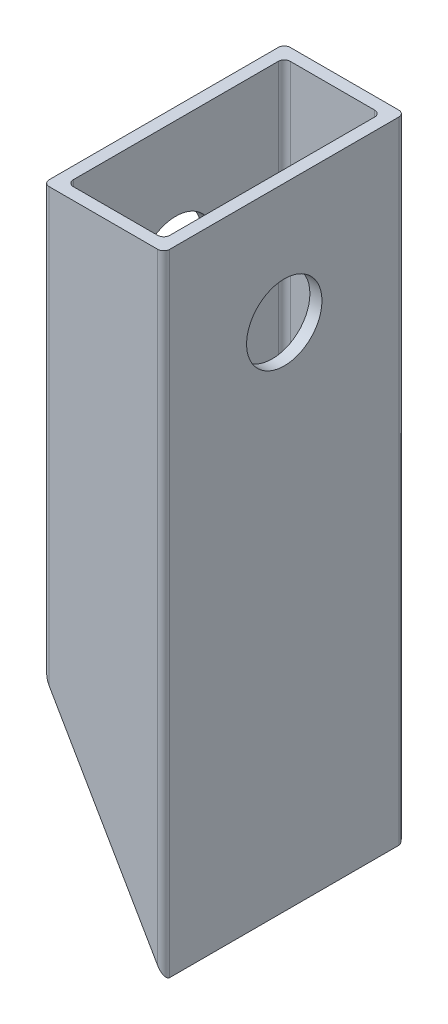
ISO-10303-21;
HEADER;
FILE_DESCRIPTION(('STEP AP214'),'2;1');
FILE_NAME('part.step','',(''),(''),'','','');
FILE_SCHEMA(('AUTOMOTIVE_DESIGN { 1 0 10303 214 1 1 1 1 }'));
ENDSEC;
DATA;
#1=APPLICATION_CONTEXT('core data for automotive mechanical design processes');
#2=APPLICATION_PROTOCOL_DEFINITION('international standard','automotive_design',2000,#1);
#3=PRODUCT_CONTEXT('',#1,'mechanical');
#4=PRODUCT('Part','Part','',(#3));
#5=PRODUCT_RELATED_PRODUCT_CATEGORY('part','',(#4));
#6=PRODUCT_DEFINITION_FORMATION('','',#4);
#7=PRODUCT_DEFINITION_CONTEXT('part definition',#1,'design');
#8=PRODUCT_DEFINITION('design','',#6,#7);
#9=PRODUCT_DEFINITION_SHAPE('','',#8);
#10=(LENGTH_UNIT() NAMED_UNIT(*) SI_UNIT(.MILLI.,.METRE.));
#11=(NAMED_UNIT(*) PLANE_ANGLE_UNIT() SI_UNIT($,.RADIAN.));
#12=(NAMED_UNIT(*) SI_UNIT($,.STERADIAN.) SOLID_ANGLE_UNIT());
#13=UNCERTAINTY_MEASURE_WITH_UNIT(LENGTH_MEASURE(1.E-05),#10,'distance_accuracy_value','');
#14=(GEOMETRIC_REPRESENTATION_CONTEXT(3) GLOBAL_UNCERTAINTY_ASSIGNED_CONTEXT((#13)) GLOBAL_UNIT_ASSIGNED_CONTEXT((#10,
#11,#12)) REPRESENTATION_CONTEXT('',''));
#15=CARTESIAN_POINT('',(0.,0.,0.));
#16=DIRECTION('',(0.,0.,1.));
#17=DIRECTION('',(1.,0.,0.));
#18=AXIS2_PLACEMENT_3D('',#15,#16,#17);
#19=CARTESIAN_POINT('',(2.,705.,-2.));
#20=DIRECTION('',(0.,-1.,0.));
#21=DIRECTION('',(0.,0.,-1.));
#22=AXIS2_PLACEMENT_3D('',#19,#20,#21);
#23=PLANE('',#22);
#24=CARTESIAN_POINT('',(2.,705.,-2.));
#25=DIRECTION('',(0.,1.,0.));
#26=DIRECTION('',(0.,0.,-1.));
#27=AXIS2_PLACEMENT_3D('',#24,#25,#26);
#28=CIRCLE('',#27,2.);
#29=CARTESIAN_POINT('',(0.,705.,-2.00000000000001));
#30=VERTEX_POINT('',#29);
#31=CARTESIAN_POINT('',(2.00000000000001,705.,0.));
#32=VERTEX_POINT('',#31);
#33=EDGE_CURVE('E241',#30,#32,#28,.T.);
#34=ORIENTED_EDGE('',*,*,#33,.T.);
#35=DIRECTION('',(1.,0.,0.));
#36=VECTOR('',#35,1.);
#37=CARTESIAN_POINT('',(2.00000000000001,705.,0.));
#38=LINE('',#37,#36);
#39=CARTESIAN_POINT('',(38.,705.,0.));
#40=VERTEX_POINT('',#39);
#41=EDGE_CURVE('E244',#32,#40,#38,.T.);
#42=ORIENTED_EDGE('',*,*,#41,.T.);
#43=CARTESIAN_POINT('',(38.,705.,-2.));
#44=DIRECTION('',(0.,1.,0.));
#45=DIRECTION('',(0.,0.,-1.));
#46=AXIS2_PLACEMENT_3D('',#43,#44,#45);
#47=CIRCLE('',#46,2.);
#48=CARTESIAN_POINT('',(40.,705.,-2.00000000000001));
#49=VERTEX_POINT('',#48);
#50=EDGE_CURVE('E246',#40,#49,#47,.T.);
#51=ORIENTED_EDGE('',*,*,#50,.T.);
#52=DIRECTION('',(0.,0.,-1.));
#53=VECTOR('',#52,1.);
#54=CARTESIAN_POINT('',(40.,705.,-2.00000000000001));
#55=LINE('',#54,#53);
#56=CARTESIAN_POINT('',(40.,705.,-78.));
#57=VERTEX_POINT('',#56);
#58=EDGE_CURVE('E248',#49,#57,#55,.T.);
#59=ORIENTED_EDGE('',*,*,#58,.T.);
#60=CARTESIAN_POINT('',(38.,705.,-78.));
#61=DIRECTION('',(0.,1.,0.));
#62=DIRECTION('',(0.,0.,-1.));
#63=AXIS2_PLACEMENT_3D('',#60,#61,#62);
#64=CIRCLE('',#63,2.);
#65=CARTESIAN_POINT('',(38.,705.,-80.));
#66=VERTEX_POINT('',#65);
#67=EDGE_CURVE('E170',#57,#66,#64,.T.);
#68=ORIENTED_EDGE('',*,*,#67,.T.);
#69=DIRECTION('',(-1.,0.,0.));
#70=VECTOR('',#69,1.);
#71=CARTESIAN_POINT('',(2.,705.,-80.));
#72=LINE('',#71,#70);
#73=CARTESIAN_POINT('',(2.,705.,-80.));
#74=VERTEX_POINT('',#73);
#75=EDGE_CURVE('E251',#66,#74,#72,.T.);
#76=ORIENTED_EDGE('',*,*,#75,.T.);
#77=CARTESIAN_POINT('',(2.,705.,-78.));
#78=DIRECTION('',(0.,1.,0.));
#79=DIRECTION('',(0.,0.,-1.));
#80=AXIS2_PLACEMENT_3D('',#77,#78,#79);
#81=CIRCLE('',#80,2.);
#82=CARTESIAN_POINT('',(0.,705.,-78.));
#83=VERTEX_POINT('',#82);
#84=EDGE_CURVE('E253',#74,#83,#81,.T.);
#85=ORIENTED_EDGE('',*,*,#84,.T.);
#86=DIRECTION('',(0.,0.,1.));
#87=VECTOR('',#86,1.);
#88=CARTESIAN_POINT('',(0.,705.,-2.00000000000001));
#89=LINE('',#88,#87);
#90=EDGE_CURVE('E255',#83,#30,#89,.T.);
#91=ORIENTED_EDGE('',*,*,#90,.T.);
#92=EDGE_LOOP('',(#34,#42,#51,#59,#68,#76,#85,#91));
#93=FACE_BOUND('',#92,.T.);
#94=CARTESIAN_POINT('',(34.,705.,-6.));
#95=DIRECTION('',(0.,1.,0.));
#96=DIRECTION('',(0.,0.,1.));
#97=AXIS2_PLACEMENT_3D('',#94,#95,#96);
#98=CIRCLE('',#97,2.);
#99=CARTESIAN_POINT('',(34.,705.,-4.));
#100=VERTEX_POINT('',#99);
#101=CARTESIAN_POINT('',(36.,705.,-6.00000000000001));
#102=VERTEX_POINT('',#101);
#103=EDGE_CURVE('E189',#100,#102,#98,.T.);
#104=ORIENTED_EDGE('',*,*,#103,.F.);
#105=DIRECTION('',(1.,0.,0.));
#106=VECTOR('',#105,1.);
#107=CARTESIAN_POINT('',(6.00000000000001,705.,-4.));
#108=LINE('',#107,#106);
#109=CARTESIAN_POINT('',(6.00000000000001,705.,-4.));
#110=VERTEX_POINT('',#109);
#111=EDGE_CURVE('E215',#110,#100,#108,.T.);
#112=ORIENTED_EDGE('',*,*,#111,.F.);
#113=CARTESIAN_POINT('',(6.,705.,-6.));
#114=DIRECTION('',(0.,1.,0.));
#115=DIRECTION('',(0.,0.,1.));
#116=AXIS2_PLACEMENT_3D('',#113,#114,#115);
#117=CIRCLE('',#116,2.);
#118=CARTESIAN_POINT('',(4.,705.,-6.00000000000002));
#119=VERTEX_POINT('',#118);
#120=EDGE_CURVE('E212',#119,#110,#117,.T.);
#121=ORIENTED_EDGE('',*,*,#120,.F.);
#122=DIRECTION('',(0.,0.,1.));
#123=VECTOR('',#122,1.);
#124=CARTESIAN_POINT('',(4.,705.,-6.00000000000001));
#125=LINE('',#124,#123);
#126=CARTESIAN_POINT('',(4.,705.,-74.));
#127=VERTEX_POINT('',#126);
#128=EDGE_CURVE('E210',#127,#119,#125,.T.);
#129=ORIENTED_EDGE('',*,*,#128,.F.);
#130=CARTESIAN_POINT('',(6.,705.,-74.));
#131=DIRECTION('',(0.,1.,0.));
#132=DIRECTION('',(0.,0.,1.));
#133=AXIS2_PLACEMENT_3D('',#130,#131,#132);
#134=CIRCLE('',#133,2.);
#135=CARTESIAN_POINT('',(6.,705.,-76.));
#136=VERTEX_POINT('',#135);
#137=EDGE_CURVE('E208',#136,#127,#134,.T.);
#138=ORIENTED_EDGE('',*,*,#137,.F.);
#139=DIRECTION('',(-1.,0.,0.));
#140=VECTOR('',#139,1.);
#141=CARTESIAN_POINT('',(6.,705.,-76.));
#142=LINE('',#141,#140);
#143=CARTESIAN_POINT('',(34.,705.,-76.));
#144=VERTEX_POINT('',#143);
#145=EDGE_CURVE('E206',#144,#136,#142,.T.);
#146=ORIENTED_EDGE('',*,*,#145,.F.);
#147=CARTESIAN_POINT('',(34.,705.,-74.));
#148=DIRECTION('',(0.,1.,0.));
#149=DIRECTION('',(0.,0.,1.));
#150=AXIS2_PLACEMENT_3D('',#147,#148,#149);
#151=CIRCLE('',#150,2.);
#152=CARTESIAN_POINT('',(36.,705.,-74.));
#153=VERTEX_POINT('',#152);
#154=EDGE_CURVE('E204',#153,#144,#151,.T.);
#155=ORIENTED_EDGE('',*,*,#154,.F.);
#156=DIRECTION('',(0.,0.,-1.));
#157=VECTOR('',#156,1.);
#158=CARTESIAN_POINT('',(36.,705.,-6.00000000000001));
#159=LINE('',#158,#157);
#160=EDGE_CURVE('E202',#102,#153,#159,.T.);
#161=ORIENTED_EDGE('',*,*,#160,.F.);
#162=EDGE_LOOP('',(#104,#112,#121,#129,#138,#146,#155,#161));
#163=FACE_BOUND('',#162,.T.);
#164=ADVANCED_FACE('F34',(#93,#163),#23,.F.);
#165=CARTESIAN_POINT('',(2.,705.,-2.));
#166=DIRECTION('',(0.,-1.,0.));
#167=DIRECTION('',(0.,0.,-1.));
#168=AXIS2_PLACEMENT_3D('',#165,#166,#167);
#169=CYLINDRICAL_SURFACE('',#168,2.);
#170=DIRECTION('',(0.,-1.,0.));
#171=VECTOR('',#170,1.);
#172=CARTESIAN_POINT('',(0.,705.,-2.00000000000001));
#173=LINE('',#172,#171);
#174=CARTESIAN_POINT('',(0.,565.,-2.00000000000001));
#175=VERTEX_POINT('',#174);
#176=EDGE_CURVE('E257',#30,#175,#173,.T.);
#177=ORIENTED_EDGE('',*,*,#176,.T.);
#178=CARTESIAN_POINT('',(2.,561.535898384862,-2.));
#179=DIRECTION('',(0.866025403784436,0.500000000000004,0.));
#180=DIRECTION('',(0.500000000000004,-0.866025403784436,0.));
#181=AXIS2_PLACEMENT_3D('',#178,#179,#180);
#182=ELLIPSE('',#181,3.99999999999997,2.);
#183=CARTESIAN_POINT('',(2.00000000000003,561.535898384862,0.));
#184=VERTEX_POINT('',#183);
#185=EDGE_CURVE('E49',#175,#184,#182,.T.);
#186=ORIENTED_EDGE('',*,*,#185,.T.);
#187=DIRECTION('',(0.,-1.,0.));
#188=VECTOR('',#187,1.);
#189=CARTESIAN_POINT('',(2.00000000000001,705.,0.));
#190=LINE('',#189,#188);
#191=EDGE_CURVE('E42',#32,#184,#190,.T.);
#192=ORIENTED_EDGE('',*,*,#191,.F.);
#193=ORIENTED_EDGE('',*,*,#33,.F.);
#194=EDGE_LOOP('',(#177,#186,#192,#193));
#195=FACE_BOUND('',#194,.T.);
#196=ADVANCED_FACE('F36',(#195),#169,.T.);
#197=CARTESIAN_POINT('',(2.00000000000001,705.,0.));
#198=DIRECTION('',(0.,0.,-1.));
#199=DIRECTION('',(-1.,0.,0.));
#200=AXIS2_PLACEMENT_3D('',#197,#198,#199);
#201=PLANE('',#200);
#202=ORIENTED_EDGE('',*,*,#191,.T.);
#203=DIRECTION('',(-0.500000000000004,0.866025403784436,0.));
#204=VECTOR('',#203,1.);
#205=CARTESIAN_POINT('',(0.,565.,0.));
#206=LINE('',#205,#204);
#207=CARTESIAN_POINT('',(38.,499.182069312383,0.));
#208=VERTEX_POINT('',#207);
#209=EDGE_CURVE('E272',#208,#184,#206,.T.);
#210=ORIENTED_EDGE('',*,*,#209,.F.);
#211=DIRECTION('',(0.,-1.,0.));
#212=VECTOR('',#211,1.);
#213=CARTESIAN_POINT('',(38.,705.,0.));
#214=LINE('',#213,#212);
#215=EDGE_CURVE('E173',#40,#208,#214,.T.);
#216=ORIENTED_EDGE('',*,*,#215,.F.);
#217=ORIENTED_EDGE('',*,*,#41,.F.);
#218=EDGE_LOOP('',(#202,#210,#216,#217));
#219=FACE_BOUND('',#218,.T.);
#220=ADVANCED_FACE('F297',(#219),#201,.F.);
#221=CARTESIAN_POINT('',(38.,705.,-2.));
#222=DIRECTION('',(0.,-1.,0.));
#223=DIRECTION('',(0.,0.,-1.));
#224=AXIS2_PLACEMENT_3D('',#221,#222,#223);
#225=CYLINDRICAL_SURFACE('',#224,2.);
#226=ORIENTED_EDGE('',*,*,#215,.T.);
#227=CARTESIAN_POINT('',(38.,499.182069312383,-2.));
#228=DIRECTION('',(0.866025403784436,0.500000000000004,0.));
#229=DIRECTION('',(0.500000000000004,-0.866025403784436,0.));
#230=AXIS2_PLACEMENT_3D('',#227,#228,#229);
#231=ELLIPSE('',#230,3.99999999999997,2.);
#232=CARTESIAN_POINT('',(40.,495.717967697246,-2.00000000000002));
#233=VERTEX_POINT('',#232);
#234=EDGE_CURVE('E155',#208,#233,#231,.T.);
#235=ORIENTED_EDGE('',*,*,#234,.T.);
#236=DIRECTION('',(0.,-1.,0.));
#237=VECTOR('',#236,1.);
#238=CARTESIAN_POINT('',(40.,705.,-2.00000000000001));
#239=LINE('',#238,#237);
#240=EDGE_CURVE('E166',#49,#233,#239,.T.);
#241=ORIENTED_EDGE('',*,*,#240,.F.);
#242=ORIENTED_EDGE('',*,*,#50,.F.);
#243=EDGE_LOOP('',(#226,#235,#241,#242));
#244=FACE_BOUND('',#243,.T.);
#245=ADVANCED_FACE('F387',(#244),#225,.T.);
#246=CARTESIAN_POINT('',(40.,705.,-2.00000000000001));
#247=DIRECTION('',(-1.,0.,0.));
#248=DIRECTION('',(0.,0.,1.));
#249=AXIS2_PLACEMENT_3D('',#246,#247,#248);
#250=PLANE('',#249);
#251=CARTESIAN_POINT('',(40.,665.,-40.));
#252=DIRECTION('',(1.,0.,0.));
#253=DIRECTION('',(0.,0.,-1.));
#254=AXIS2_PLACEMENT_3D('',#251,#252,#253);
#255=CIRCLE('',#254,12.5);
#256=CARTESIAN_POINT('',(40.,665.,-52.5));
#257=VERTEX_POINT('',#256);
#258=EDGE_CURVE('E192',#257,#257,#255,.T.);
#259=ORIENTED_EDGE('',*,*,#258,.F.);
#260=EDGE_LOOP('',(#259));
#261=FACE_BOUND('',#260,.T.);
#262=ORIENTED_EDGE('',*,*,#240,.T.);
#263=DIRECTION('',(0.,0.,1.));
#264=VECTOR('',#263,1.);
#265=CARTESIAN_POINT('',(40.,495.717967697246,-80.));
#266=LINE('',#265,#264);
#267=CARTESIAN_POINT('',(40.,495.717967697246,-78.));
#268=VERTEX_POINT('',#267);
#269=EDGE_CURVE('E147',#268,#233,#266,.T.);
#270=ORIENTED_EDGE('',*,*,#269,.F.);
#271=DIRECTION('',(0.,-1.,0.));
#272=VECTOR('',#271,1.);
#273=CARTESIAN_POINT('',(40.,705.,-78.));
#274=LINE('',#273,#272);
#275=EDGE_CURVE('E163',#57,#268,#274,.T.);
#276=ORIENTED_EDGE('',*,*,#275,.F.);
#277=ORIENTED_EDGE('',*,*,#58,.F.);
#278=EDGE_LOOP('',(#262,#270,#276,#277));
#279=FACE_BOUND('',#278,.T.);
#280=ADVANCED_FACE('F161',(#261,#279),#250,.F.);
#281=CARTESIAN_POINT('',(38.,705.,-78.));
#282=DIRECTION('',(0.,-1.,0.));
#283=DIRECTION('',(0.,0.,-1.));
#284=AXIS2_PLACEMENT_3D('',#281,#282,#283);
#285=CYLINDRICAL_SURFACE('',#284,2.);
#286=ORIENTED_EDGE('',*,*,#275,.T.);
#287=CARTESIAN_POINT('',(38.,499.182069312383,-78.));
#288=DIRECTION('',(0.866025403784436,0.500000000000004,0.));
#289=DIRECTION('',(0.500000000000004,-0.866025403784436,0.));
#290=AXIS2_PLACEMENT_3D('',#287,#288,#289);
#291=ELLIPSE('',#290,3.99999999999997,2.);
#292=CARTESIAN_POINT('',(38.,499.182069312383,-80.));
#293=VERTEX_POINT('',#292);
#294=EDGE_CURVE('E144',#268,#293,#291,.T.);
#295=ORIENTED_EDGE('',*,*,#294,.T.);
#296=DIRECTION('',(0.,-1.,0.));
#297=VECTOR('',#296,1.);
#298=CARTESIAN_POINT('',(38.,705.,-80.));
#299=LINE('',#298,#297);
#300=EDGE_CURVE('E171',#66,#293,#299,.T.);
#301=ORIENTED_EDGE('',*,*,#300,.F.);
#302=ORIENTED_EDGE('',*,*,#67,.F.);
#303=EDGE_LOOP('',(#286,#295,#301,#302));
#304=FACE_BOUND('',#303,.T.);
#305=ADVANCED_FACE('F169',(#304),#285,.T.);
#306=CARTESIAN_POINT('',(2.,705.,-80.));
#307=DIRECTION('',(0.,0.,1.));
#308=DIRECTION('',(1.,0.,0.));
#309=AXIS2_PLACEMENT_3D('',#306,#307,#308);
#310=PLANE('',#309);
#311=ORIENTED_EDGE('',*,*,#300,.T.);
#312=DIRECTION('',(-0.500000000000004,0.866025403784436,0.));
#313=VECTOR('',#312,1.);
#314=CARTESIAN_POINT('',(0.,565.,-80.));
#315=LINE('',#314,#313);
#316=CARTESIAN_POINT('',(2.00000000000001,561.535898384862,-80.));
#317=VERTEX_POINT('',#316);
#318=EDGE_CURVE('E150',#293,#317,#315,.T.);
#319=ORIENTED_EDGE('',*,*,#318,.T.);
#320=DIRECTION('',(0.,-1.,0.));
#321=VECTOR('',#320,1.);
#322=CARTESIAN_POINT('',(2.,705.,-80.));
#323=LINE('',#322,#321);
#324=EDGE_CURVE('E175',#74,#317,#323,.T.);
#325=ORIENTED_EDGE('',*,*,#324,.F.);
#326=ORIENTED_EDGE('',*,*,#75,.F.);
#327=EDGE_LOOP('',(#311,#319,#325,#326));
#328=FACE_BOUND('',#327,.T.);
#329=ADVANCED_FACE('F271',(#328),#310,.F.);
#330=CARTESIAN_POINT('',(2.,705.,-78.));
#331=DIRECTION('',(0.,-1.,0.));
#332=DIRECTION('',(0.,0.,-1.));
#333=AXIS2_PLACEMENT_3D('',#330,#331,#332);
#334=CYLINDRICAL_SURFACE('',#333,2.);
#335=ORIENTED_EDGE('',*,*,#324,.T.);
#336=CARTESIAN_POINT('',(2.,561.535898384862,-78.));
#337=DIRECTION('',(0.866025403784436,0.500000000000004,0.));
#338=DIRECTION('',(0.500000000000004,-0.866025403784436,0.));
#339=AXIS2_PLACEMENT_3D('',#336,#337,#338);
#340=ELLIPSE('',#339,3.99999999999997,2.);
#341=CARTESIAN_POINT('',(0.,565.,-78.));
#342=VERTEX_POINT('',#341);
#343=EDGE_CURVE('E156',#317,#342,#340,.T.);
#344=ORIENTED_EDGE('',*,*,#343,.T.);
#345=DIRECTION('',(0.,-1.,0.));
#346=VECTOR('',#345,1.);
#347=CARTESIAN_POINT('',(0.,705.,-78.));
#348=LINE('',#347,#346);
#349=EDGE_CURVE('E260',#83,#342,#348,.T.);
#350=ORIENTED_EDGE('',*,*,#349,.F.);
#351=ORIENTED_EDGE('',*,*,#84,.F.);
#352=EDGE_LOOP('',(#335,#344,#350,#351));
#353=FACE_BOUND('',#352,.T.);
#354=ADVANCED_FACE('F267',(#353),#334,.T.);
#355=CARTESIAN_POINT('',(0.,705.,-2.00000000000001));
#356=DIRECTION('',(1.,0.,0.));
#357=DIRECTION('',(0.,0.,-1.));
#358=AXIS2_PLACEMENT_3D('',#355,#356,#357);
#359=PLANE('',#358);
#360=CARTESIAN_POINT('',(0.,665.,-40.));
#361=DIRECTION('',(1.,0.,0.));
#362=DIRECTION('',(0.,0.,-1.));
#363=AXIS2_PLACEMENT_3D('',#360,#361,#362);
#364=CIRCLE('',#363,12.5);
#365=CARTESIAN_POINT('',(0.,665.,-52.5));
#366=VERTEX_POINT('',#365);
#367=EDGE_CURVE('E185',#366,#366,#364,.T.);
#368=ORIENTED_EDGE('',*,*,#367,.T.);
#369=EDGE_LOOP('',(#368));
#370=FACE_BOUND('',#369,.T.);
#371=ORIENTED_EDGE('',*,*,#349,.T.);
#372=DIRECTION('',(0.,0.,1.));
#373=VECTOR('',#372,1.);
#374=CARTESIAN_POINT('',(0.,565.,-80.));
#375=LINE('',#374,#373);
#376=EDGE_CURVE('E167',#342,#175,#375,.T.);
#377=ORIENTED_EDGE('',*,*,#376,.T.);
#378=ORIENTED_EDGE('',*,*,#176,.F.);
#379=ORIENTED_EDGE('',*,*,#90,.F.);
#380=EDGE_LOOP('',(#371,#377,#378,#379));
#381=FACE_BOUND('',#380,.T.);
#382=ADVANCED_FACE('F304',(#370,#381),#359,.F.);
#383=CARTESIAN_POINT('',(34.,705.,-6.));
#384=DIRECTION('',(0.,-1.,0.));
#385=DIRECTION('',(0.,0.,-1.));
#386=AXIS2_PLACEMENT_3D('',#383,#384,#385);
#387=CYLINDRICAL_SURFACE('',#386,2.);
#388=CARTESIAN_POINT('',(34.,506.110272542659,-6.));
#389=DIRECTION('',(0.866025403784436,0.500000000000004,0.));
#390=DIRECTION('',(0.500000000000004,-0.866025403784436,0.));
#391=AXIS2_PLACEMENT_3D('',#388,#389,#390);
#392=ELLIPSE('',#391,3.99999999999997,2.);
#393=CARTESIAN_POINT('',(34.,506.110272542659,-4.));
#394=VERTEX_POINT('',#393);
#395=CARTESIAN_POINT('',(36.,502.646170927521,-6.00000000000001));
#396=VERTEX_POINT('',#395);
#397=EDGE_CURVE('E288',#394,#396,#392,.T.);
#398=ORIENTED_EDGE('',*,*,#397,.F.);
#399=DIRECTION('',(0.,-1.,0.));
#400=VECTOR('',#399,1.);
#401=CARTESIAN_POINT('',(34.,705.,-4.));
#402=LINE('',#401,#400);
#403=EDGE_CURVE('E217',#100,#394,#402,.T.);
#404=ORIENTED_EDGE('',*,*,#403,.F.);
#405=ORIENTED_EDGE('',*,*,#103,.T.);
#406=DIRECTION('',(0.,-1.,0.));
#407=VECTOR('',#406,1.);
#408=CARTESIAN_POINT('',(36.,705.,-6.00000000000001));
#409=LINE('',#408,#407);
#410=EDGE_CURVE('E238',#102,#396,#409,.T.);
#411=ORIENTED_EDGE('',*,*,#410,.T.);
#412=EDGE_LOOP('',(#398,#404,#405,#411));
#413=FACE_BOUND('',#412,.T.);
#414=ADVANCED_FACE('F306',(#413),#387,.F.);
#415=CARTESIAN_POINT('',(36.,705.,-6.00000000000001));
#416=DIRECTION('',(-1.,0.,0.));
#417=DIRECTION('',(0.,0.,1.));
#418=AXIS2_PLACEMENT_3D('',#415,#416,#417);
#419=PLANE('',#418);
#420=DIRECTION('',(0.,0.,-1.));
#421=VECTOR('',#420,1.);
#422=CARTESIAN_POINT('',(36.,502.646170927521,-6.00000000000001));
#423=LINE('',#422,#421);
#424=CARTESIAN_POINT('',(36.,502.646170927521,-74.));
#425=VERTEX_POINT('',#424);
#426=EDGE_CURVE('E286',#396,#425,#423,.T.);
#427=ORIENTED_EDGE('',*,*,#426,.F.);
#428=ORIENTED_EDGE('',*,*,#410,.F.);
#429=ORIENTED_EDGE('',*,*,#160,.T.);
#430=DIRECTION('',(0.,-1.,0.));
#431=VECTOR('',#430,1.);
#432=CARTESIAN_POINT('',(36.,705.,-74.));
#433=LINE('',#432,#431);
#434=EDGE_CURVE('E235',#153,#425,#433,.T.);
#435=ORIENTED_EDGE('',*,*,#434,.T.);
#436=EDGE_LOOP('',(#427,#428,#429,#435));
#437=FACE_BOUND('',#436,.T.);
#438=CARTESIAN_POINT('',(36.,665.,-40.));
#439=DIRECTION('',(-1.,0.,0.));
#440=DIRECTION('',(0.,0.,1.));
#441=AXIS2_PLACEMENT_3D('',#438,#439,#440);
#442=CIRCLE('',#441,12.5);
#443=CARTESIAN_POINT('',(36.,665.,-27.5));
#444=VERTEX_POINT('',#443);
#445=EDGE_CURVE('E184',#444,#444,#442,.T.);
#446=ORIENTED_EDGE('',*,*,#445,.F.);
#447=EDGE_LOOP('',(#446));
#448=FACE_BOUND('',#447,.T.);
#449=ADVANCED_FACE('F312',(#437,#448),#419,.T.);
#450=CARTESIAN_POINT('',(34.,705.,-74.));
#451=DIRECTION('',(0.,-1.,0.));
#452=DIRECTION('',(0.,0.,-1.));
#453=AXIS2_PLACEMENT_3D('',#450,#451,#452);
#454=CYLINDRICAL_SURFACE('',#453,2.);
#455=CARTESIAN_POINT('',(34.,506.110272542659,-74.));
#456=DIRECTION('',(0.866025403784436,0.500000000000004,0.));
#457=DIRECTION('',(0.500000000000004,-0.866025403784436,0.));
#458=AXIS2_PLACEMENT_3D('',#455,#456,#457);
#459=ELLIPSE('',#458,3.99999999999997,2.);
#460=CARTESIAN_POINT('',(34.,506.110272542659,-76.));
#461=VERTEX_POINT('',#460);
#462=EDGE_CURVE('E284',#425,#461,#459,.T.);
#463=ORIENTED_EDGE('',*,*,#462,.F.);
#464=ORIENTED_EDGE('',*,*,#434,.F.);
#465=ORIENTED_EDGE('',*,*,#154,.T.);
#466=DIRECTION('',(0.,-1.,0.));
#467=VECTOR('',#466,1.);
#468=CARTESIAN_POINT('',(34.,705.,-76.));
#469=LINE('',#468,#467);
#470=EDGE_CURVE('E232',#144,#461,#469,.T.);
#471=ORIENTED_EDGE('',*,*,#470,.T.);
#472=EDGE_LOOP('',(#463,#464,#465,#471));
#473=FACE_BOUND('',#472,.T.);
#474=ADVANCED_FACE('F325',(#473),#454,.F.);
#475=CARTESIAN_POINT('',(6.,705.,-76.));
#476=DIRECTION('',(0.,0.,1.));
#477=DIRECTION('',(1.,0.,0.));
#478=AXIS2_PLACEMENT_3D('',#475,#476,#477);
#479=PLANE('',#478);
#480=DIRECTION('',(-0.500000000000004,0.866025403784436,0.));
#481=VECTOR('',#480,1.);
#482=CARTESIAN_POINT('',(-59.121778264911,667.401923788646,-76.));
#483=LINE('',#482,#481);
#484=CARTESIAN_POINT('',(6.,554.607695154587,-76.));
#485=VERTEX_POINT('',#484);
#486=EDGE_CURVE('E282',#461,#485,#483,.T.);
#487=ORIENTED_EDGE('',*,*,#486,.F.);
#488=ORIENTED_EDGE('',*,*,#470,.F.);
#489=ORIENTED_EDGE('',*,*,#145,.T.);
#490=DIRECTION('',(0.,-1.,0.));
#491=VECTOR('',#490,1.);
#492=CARTESIAN_POINT('',(6.,705.,-76.));
#493=LINE('',#492,#491);
#494=EDGE_CURVE('E229',#136,#485,#493,.T.);
#495=ORIENTED_EDGE('',*,*,#494,.T.);
#496=EDGE_LOOP('',(#487,#488,#489,#495));
#497=FACE_BOUND('',#496,.T.);
#498=ADVANCED_FACE('F329',(#497),#479,.T.);
#499=CARTESIAN_POINT('',(6.,705.,-74.));
#500=DIRECTION('',(0.,-1.,0.));
#501=DIRECTION('',(0.,0.,-1.));
#502=AXIS2_PLACEMENT_3D('',#499,#500,#501);
#503=CYLINDRICAL_SURFACE('',#502,2.);
#504=CARTESIAN_POINT('',(6.,554.607695154587,-74.));
#505=DIRECTION('',(0.866025403784436,0.500000000000004,0.));
#506=DIRECTION('',(0.500000000000004,-0.866025403784436,0.));
#507=AXIS2_PLACEMENT_3D('',#504,#505,#506);
#508=ELLIPSE('',#507,3.99999999999997,2.);
#509=CARTESIAN_POINT('',(4.,558.071796769725,-74.));
#510=VERTEX_POINT('',#509);
#511=EDGE_CURVE('E280',#485,#510,#508,.T.);
#512=ORIENTED_EDGE('',*,*,#511,.F.);
#513=ORIENTED_EDGE('',*,*,#494,.F.);
#514=ORIENTED_EDGE('',*,*,#137,.T.);
#515=DIRECTION('',(0.,-1.,0.));
#516=VECTOR('',#515,1.);
#517=CARTESIAN_POINT('',(4.,705.,-74.));
#518=LINE('',#517,#516);
#519=EDGE_CURVE('E226',#127,#510,#518,.T.);
#520=ORIENTED_EDGE('',*,*,#519,.T.);
#521=EDGE_LOOP('',(#512,#513,#514,#520));
#522=FACE_BOUND('',#521,.T.);
#523=ADVANCED_FACE('F333',(#522),#503,.F.);
#524=CARTESIAN_POINT('',(4.,705.,-6.00000000000001));
#525=DIRECTION('',(1.,0.,0.));
#526=DIRECTION('',(0.,0.,-1.));
#527=AXIS2_PLACEMENT_3D('',#524,#525,#526);
#528=PLANE('',#527);
#529=DIRECTION('',(0.,0.,1.));
#530=VECTOR('',#529,1.);
#531=CARTESIAN_POINT('',(4.,558.071796769725,-6.00000000000001));
#532=LINE('',#531,#530);
#533=CARTESIAN_POINT('',(4.,558.071796769725,-6.00000000000002));
#534=VERTEX_POINT('',#533);
#535=EDGE_CURVE('E278',#510,#534,#532,.T.);
#536=ORIENTED_EDGE('',*,*,#535,.F.);
#537=ORIENTED_EDGE('',*,*,#519,.F.);
#538=ORIENTED_EDGE('',*,*,#128,.T.);
#539=DIRECTION('',(0.,-1.,0.));
#540=VECTOR('',#539,1.);
#541=CARTESIAN_POINT('',(4.,705.,-6.00000000000002));
#542=LINE('',#541,#540);
#543=EDGE_CURVE('E223',#119,#534,#542,.T.);
#544=ORIENTED_EDGE('',*,*,#543,.T.);
#545=EDGE_LOOP('',(#536,#537,#538,#544));
#546=FACE_BOUND('',#545,.T.);
#547=CARTESIAN_POINT('',(4.,665.,-40.));
#548=DIRECTION('',(1.,0.,0.));
#549=DIRECTION('',(0.,0.,-1.));
#550=AXIS2_PLACEMENT_3D('',#547,#548,#549);
#551=CIRCLE('',#550,12.5);
#552=CARTESIAN_POINT('',(4.,665.,-52.5));
#553=VERTEX_POINT('',#552);
#554=EDGE_CURVE('E182',#553,#553,#551,.T.);
#555=ORIENTED_EDGE('',*,*,#554,.F.);
#556=EDGE_LOOP('',(#555));
#557=FACE_BOUND('',#556,.T.);
#558=ADVANCED_FACE('F337',(#546,#557),#528,.T.);
#559=CARTESIAN_POINT('',(6.,705.,-6.));
#560=DIRECTION('',(0.,-1.,0.));
#561=DIRECTION('',(0.,0.,-1.));
#562=AXIS2_PLACEMENT_3D('',#559,#560,#561);
#563=CYLINDRICAL_SURFACE('',#562,2.);
#564=CARTESIAN_POINT('',(6.,554.607695154587,-6.));
#565=DIRECTION('',(0.866025403784436,0.500000000000004,0.));
#566=DIRECTION('',(0.500000000000004,-0.866025403784436,0.));
#567=AXIS2_PLACEMENT_3D('',#564,#565,#566);
#568=ELLIPSE('',#567,3.99999999999997,2.);
#569=CARTESIAN_POINT('',(6.00000000000003,554.607695154587,-4.));
#570=VERTEX_POINT('',#569);
#571=EDGE_CURVE('E56',#534,#570,#568,.T.);
#572=ORIENTED_EDGE('',*,*,#571,.F.);
#573=ORIENTED_EDGE('',*,*,#543,.F.);
#574=ORIENTED_EDGE('',*,*,#120,.T.);
#575=DIRECTION('',(0.,-1.,0.));
#576=VECTOR('',#575,1.);
#577=CARTESIAN_POINT('',(6.00000000000001,705.,-4.));
#578=LINE('',#577,#576);
#579=EDGE_CURVE('E220',#110,#570,#578,.T.);
#580=ORIENTED_EDGE('',*,*,#579,.T.);
#581=EDGE_LOOP('',(#572,#573,#574,#580));
#582=FACE_BOUND('',#581,.T.);
#583=ADVANCED_FACE('F341',(#582),#563,.F.);
#584=CARTESIAN_POINT('',(6.00000000000001,705.,-4.));
#585=DIRECTION('',(0.,0.,-1.));
#586=DIRECTION('',(-1.,0.,0.));
#587=AXIS2_PLACEMENT_3D('',#584,#585,#586);
#588=PLANE('',#587);
#589=DIRECTION('',(0.500000000000004,-0.866025403784436,0.));
#590=VECTOR('',#589,1.);
#591=CARTESIAN_POINT('',(-59.121778264911,667.401923788646,-4.));
#592=LINE('',#591,#590);
#593=EDGE_CURVE('E11',#570,#394,#592,.T.);
#594=ORIENTED_EDGE('',*,*,#593,.F.);
#595=ORIENTED_EDGE('',*,*,#579,.F.);
#596=ORIENTED_EDGE('',*,*,#111,.T.);
#597=ORIENTED_EDGE('',*,*,#403,.T.);
#598=EDGE_LOOP('',(#594,#595,#596,#597));
#599=FACE_BOUND('',#598,.T.);
#600=ADVANCED_FACE('F345',(#599),#588,.T.);
#601=CARTESIAN_POINT('',(0.,665.,-40.));
#602=DIRECTION('',(1.,0.,0.));
#603=DIRECTION('',(0.,0.,-1.));
#604=AXIS2_PLACEMENT_3D('',#601,#602,#603);
#605=CYLINDRICAL_SURFACE('',#604,12.5);
#606=ORIENTED_EDGE('',*,*,#554,.T.);
#607=EDGE_LOOP('',(#606));
#608=FACE_BOUND('',#607,.T.);
#609=ORIENTED_EDGE('',*,*,#367,.F.);
#610=EDGE_LOOP('',(#609));
#611=FACE_BOUND('',#610,.T.);
#612=ADVANCED_FACE('F349',(#608,#611),#605,.F.);
#613=ORIENTED_EDGE('',*,*,#445,.T.);
#614=EDGE_LOOP('',(#613));
#615=FACE_BOUND('',#614,.T.);
#616=ORIENTED_EDGE('',*,*,#258,.T.);
#617=EDGE_LOOP('',(#616));
#618=FACE_BOUND('',#617,.T.);
#619=ADVANCED_FACE('F353',(#615,#618),#605,.F.);
#620=CARTESIAN_POINT('',(0.,565.,-80.));
#621=DIRECTION('',(0.866025403784436,0.500000000000004,0.));
#622=DIRECTION('',(-0.500000000000004,0.866025403784436,0.));
#623=AXIS2_PLACEMENT_3D('',#620,#621,#622);
#624=PLANE('',#623);
#625=ORIENTED_EDGE('',*,*,#397,.T.);
#626=ORIENTED_EDGE('',*,*,#426,.T.);
#627=ORIENTED_EDGE('',*,*,#462,.T.);
#628=ORIENTED_EDGE('',*,*,#486,.T.);
#629=ORIENTED_EDGE('',*,*,#511,.T.);
#630=ORIENTED_EDGE('',*,*,#535,.T.);
#631=ORIENTED_EDGE('',*,*,#571,.T.);
#632=ORIENTED_EDGE('',*,*,#593,.T.);
#633=EDGE_LOOP('',(#625,#626,#627,#628,#629,#630,#631,#632));
#634=FACE_BOUND('',#633,.T.);
#635=ORIENTED_EDGE('',*,*,#376,.F.);
#636=ORIENTED_EDGE('',*,*,#343,.F.);
#637=ORIENTED_EDGE('',*,*,#318,.F.);
#638=ORIENTED_EDGE('',*,*,#294,.F.);
#639=ORIENTED_EDGE('',*,*,#269,.T.);
#640=ORIENTED_EDGE('',*,*,#234,.F.);
#641=ORIENTED_EDGE('',*,*,#209,.T.);
#642=ORIENTED_EDGE('',*,*,#185,.F.);
#643=EDGE_LOOP('',(#635,#636,#637,#638,#639,#640,#641,#642));
#644=FACE_BOUND('',#643,.T.);
#645=ADVANCED_FACE('F146',(#634,#644),#624,.F.);
#646=CLOSED_SHELL('',(#164,#196,#220,#245,#280,#305,#329,#354,#382,#414,#449,#474,#498,#523,
#558,#583,#600,#612,#619,#645));
#647=MANIFOLD_SOLID_BREP('B2',#646);
#648=ADVANCED_BREP_SHAPE_REPRESENTATION('',(#18,#647),#14);
#649=SHAPE_DEFINITION_REPRESENTATION(#9,#648);
ENDSEC;
END-ISO-10303-21;
